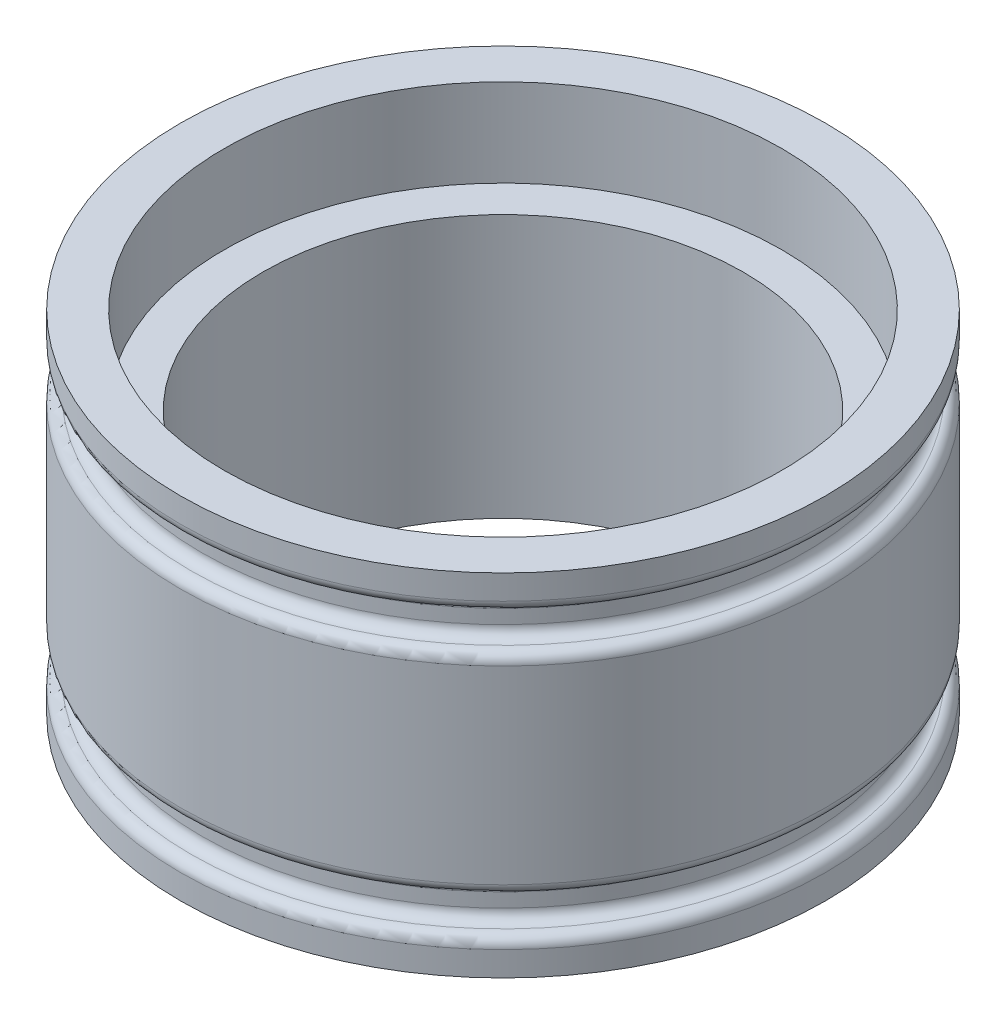
ISO-10303-21;
HEADER;
FILE_DESCRIPTION(('STEP AP214'),'2;1');
FILE_NAME('part.step','',(''),(''),'','','');
FILE_SCHEMA(('AUTOMOTIVE_DESIGN { 1 0 10303 214 1 1 1 1 }'));
ENDSEC;
DATA;
#1=APPLICATION_CONTEXT('core data for automotive mechanical design processes');
#2=APPLICATION_PROTOCOL_DEFINITION('international standard','automotive_design',2000,#1);
#3=PRODUCT_CONTEXT('',#1,'mechanical');
#4=PRODUCT('Part','Part','',(#3));
#5=PRODUCT_RELATED_PRODUCT_CATEGORY('part','',(#4));
#6=PRODUCT_DEFINITION_FORMATION('','',#4);
#7=PRODUCT_DEFINITION_CONTEXT('part definition',#1,'design');
#8=PRODUCT_DEFINITION('design','',#6,#7);
#9=PRODUCT_DEFINITION_SHAPE('','',#8);
#10=(LENGTH_UNIT() NAMED_UNIT(*) SI_UNIT(.MILLI.,.METRE.));
#11=(NAMED_UNIT(*) PLANE_ANGLE_UNIT() SI_UNIT($,.RADIAN.));
#12=(NAMED_UNIT(*) SI_UNIT($,.STERADIAN.) SOLID_ANGLE_UNIT());
#13=UNCERTAINTY_MEASURE_WITH_UNIT(LENGTH_MEASURE(1.E-05),#10,'distance_accuracy_value','');
#14=(GEOMETRIC_REPRESENTATION_CONTEXT(3) GLOBAL_UNCERTAINTY_ASSIGNED_CONTEXT((#13)) GLOBAL_UNIT_ASSIGNED_CONTEXT((#10,
#11,#12)) REPRESENTATION_CONTEXT('',''));
#15=CARTESIAN_POINT('',(0.,0.,0.));
#16=DIRECTION('',(0.,0.,1.));
#17=DIRECTION('',(1.,0.,0.));
#18=AXIS2_PLACEMENT_3D('',#15,#16,#17);
#19=CARTESIAN_POINT('',(0.,25.4,0.));
#20=DIRECTION('',(0.,-1.,0.));
#21=DIRECTION('',(0.,0.,-1.));
#22=AXIS2_PLACEMENT_3D('',#19,#20,#21);
#23=CYLINDRICAL_SURFACE('',#22,23.368);
#24=CARTESIAN_POINT('',(0.,1.778,0.));
#25=DIRECTION('',(0.,-1.,0.));
#26=DIRECTION('',(0.,0.,-1.));
#27=AXIS2_PLACEMENT_3D('',#24,#25,#26);
#28=CIRCLE('',#27,23.368);
#29=CARTESIAN_POINT('',(0.,1.778,-23.368));
#30=VERTEX_POINT('',#29);
#31=EDGE_CURVE('E134',#30,#30,#28,.T.);
#32=ORIENTED_EDGE('',*,*,#31,.T.);
#33=EDGE_LOOP('',(#32));
#34=FACE_BOUND('',#33,.T.);
#35=CARTESIAN_POINT('',(0.,0.,0.));
#36=DIRECTION('',(0.,1.,0.));
#37=DIRECTION('',(0.,0.,1.));
#38=AXIS2_PLACEMENT_3D('',#35,#36,#37);
#39=CIRCLE('',#38,23.368);
#40=CARTESIAN_POINT('',(0.,0.,23.368));
#41=VERTEX_POINT('',#40);
#42=EDGE_CURVE('E169',#41,#41,#39,.T.);
#43=ORIENTED_EDGE('',*,*,#42,.T.);
#44=EDGE_LOOP('',(#43));
#45=FACE_BOUND('',#44,.T.);
#46=ADVANCED_FACE('F41',(#34,#45),#23,.T.);
#47=CARTESIAN_POINT('',(0.,25.4,0.));
#48=DIRECTION('',(0.,1.,0.));
#49=DIRECTION('',(0.,0.,1.));
#50=AXIS2_PLACEMENT_3D('',#47,#48,#49);
#51=PLANE('',#50);
#52=CARTESIAN_POINT('',(0.,25.4,0.));
#53=DIRECTION('',(0.,1.,0.));
#54=DIRECTION('',(0.,0.,1.));
#55=AXIS2_PLACEMENT_3D('',#52,#53,#54);
#56=CIRCLE('',#55,23.368);
#57=CARTESIAN_POINT('',(0.,25.4,23.368));
#58=VERTEX_POINT('',#57);
#59=EDGE_CURVE('E166',#58,#58,#56,.T.);
#60=ORIENTED_EDGE('',*,*,#59,.T.);
#61=EDGE_LOOP('',(#60));
#62=FACE_BOUND('',#61,.T.);
#63=CARTESIAN_POINT('',(0.,25.4,0.));
#64=DIRECTION('',(0.,1.,0.));
#65=DIRECTION('',(0.,0.,1.));
#66=AXIS2_PLACEMENT_3D('',#63,#64,#65);
#67=CIRCLE('',#66,20.193);
#68=CARTESIAN_POINT('',(0.,25.4,20.193));
#69=VERTEX_POINT('',#68);
#70=EDGE_CURVE('E173',#69,#69,#67,.T.);
#71=ORIENTED_EDGE('',*,*,#70,.F.);
#72=EDGE_LOOP('',(#71));
#73=FACE_BOUND('',#72,.T.);
#74=ADVANCED_FACE('F91',(#62,#73),#51,.T.);
#75=CARTESIAN_POINT('',(0.,0.,0.));
#76=DIRECTION('',(0.,1.,0.));
#77=DIRECTION('',(0.,0.,1.));
#78=AXIS2_PLACEMENT_3D('',#75,#76,#77);
#79=PLANE('',#78);
#80=ORIENTED_EDGE('',*,*,#42,.F.);
#81=EDGE_LOOP('',(#80));
#82=FACE_BOUND('',#81,.T.);
#83=CARTESIAN_POINT('',(0.,0.,0.));
#84=DIRECTION('',(0.,-1.,0.));
#85=DIRECTION('',(0.,0.,-1.));
#86=AXIS2_PLACEMENT_3D('',#83,#84,#85);
#87=CIRCLE('',#86,17.399);
#88=CARTESIAN_POINT('',(0.,0.,-17.399));
#89=VERTEX_POINT('',#88);
#90=EDGE_CURVE('E64',#89,#89,#87,.T.);
#91=ORIENTED_EDGE('',*,*,#90,.F.);
#92=EDGE_LOOP('',(#91));
#93=FACE_BOUND('',#92,.T.);
#94=ADVANCED_FACE('F99',(#82,#93),#79,.F.);
#95=CARTESIAN_POINT('',(0.,23.622,0.));
#96=DIRECTION('',(0.,1.,0.));
#97=DIRECTION('',(0.,0.,1.));
#98=AXIS2_PLACEMENT_3D('',#95,#96,#97);
#99=CIRCLE('',#98,23.368);
#100=CARTESIAN_POINT('',(0.,23.622,23.368));
#101=VERTEX_POINT('',#100);
#102=EDGE_CURVE('E11',#101,#101,#99,.T.);
#103=ORIENTED_EDGE('',*,*,#102,.T.);
#104=EDGE_LOOP('',(#103));
#105=FACE_BOUND('',#104,.T.);
#106=ORIENTED_EDGE('',*,*,#59,.F.);
#107=EDGE_LOOP('',(#106));
#108=FACE_BOUND('',#107,.T.);
#109=ADVANCED_FACE('F94',(#105,#108),#23,.T.);
#110=CARTESIAN_POINT('',(0.,25.4,0.));
#111=DIRECTION('',(0.,-1.,0.));
#112=DIRECTION('',(0.,0.,-1.));
#113=AXIS2_PLACEMENT_3D('',#110,#111,#112);
#114=CYLINDRICAL_SURFACE('',#113,20.193);
#115=CARTESIAN_POINT('',(0.,19.05,0.));
#116=DIRECTION('',(0.,1.,0.));
#117=DIRECTION('',(0.,0.,1.));
#118=AXIS2_PLACEMENT_3D('',#115,#116,#117);
#119=CIRCLE('',#118,20.193);
#120=CARTESIAN_POINT('',(0.,19.05,20.193));
#121=VERTEX_POINT('',#120);
#122=EDGE_CURVE('E163',#121,#121,#119,.T.);
#123=ORIENTED_EDGE('',*,*,#122,.F.);
#124=EDGE_LOOP('',(#123));
#125=FACE_BOUND('',#124,.T.);
#126=ORIENTED_EDGE('',*,*,#70,.T.);
#127=EDGE_LOOP('',(#126));
#128=FACE_BOUND('',#127,.T.);
#129=ADVANCED_FACE('F107',(#125,#128),#114,.F.);
#130=CARTESIAN_POINT('',(0.,82.5144289299998,0.));
#131=DIRECTION('',(0.,-1.,0.));
#132=DIRECTION('',(0.,0.,-1.));
#133=AXIS2_PLACEMENT_3D('',#130,#131,#132);
#134=CYLINDRICAL_SURFACE('',#133,17.399);
#135=ORIENTED_EDGE('',*,*,#90,.T.);
#136=EDGE_LOOP('',(#135));
#137=FACE_BOUND('',#136,.T.);
#138=CARTESIAN_POINT('',(0.,19.05,0.));
#139=DIRECTION('',(0.,1.,0.));
#140=DIRECTION('',(0.,0.,1.));
#141=AXIS2_PLACEMENT_3D('',#138,#139,#140);
#142=CIRCLE('',#141,17.399);
#143=CARTESIAN_POINT('',(0.,19.05,17.399));
#144=VERTEX_POINT('',#143);
#145=EDGE_CURVE('E180',#144,#144,#142,.F.);
#146=ORIENTED_EDGE('',*,*,#145,.F.);
#147=EDGE_LOOP('',(#146));
#148=FACE_BOUND('',#147,.T.);
#149=ADVANCED_FACE('F188',(#137,#148),#134,.F.);
#150=CARTESIAN_POINT('',(0.,19.05,0.));
#151=DIRECTION('',(0.,1.,0.));
#152=DIRECTION('',(0.,0.,1.));
#153=AXIS2_PLACEMENT_3D('',#150,#151,#152);
#154=PLANE('',#153);
#155=ORIENTED_EDGE('',*,*,#122,.T.);
#156=EDGE_LOOP('',(#155));
#157=FACE_BOUND('',#156,.T.);
#158=ORIENTED_EDGE('',*,*,#145,.T.);
#159=EDGE_LOOP('',(#158));
#160=FACE_BOUND('',#159,.T.);
#161=ADVANCED_FACE('F157',(#157,#160),#154,.T.);
#162=CARTESIAN_POINT('',(0.,0.,0.));
#163=DIRECTION('',(0.,1.,0.));
#164=DIRECTION('',(0.,0.,1.));
#165=AXIS2_PLACEMENT_3D('',#162,#163,#164);
#166=CYLINDRICAL_SURFACE('',#165,21.844);
#167=CARTESIAN_POINT('',(0.,3.302,0.));
#168=DIRECTION('',(0.,-1.,0.));
#169=DIRECTION('',(0.,0.,-1.));
#170=AXIS2_PLACEMENT_3D('',#167,#168,#169);
#171=CIRCLE('',#170,21.844);
#172=CARTESIAN_POINT('',(0.,3.302,-21.844));
#173=VERTEX_POINT('',#172);
#174=EDGE_CURVE('E130',#173,#173,#171,.F.);
#175=ORIENTED_EDGE('',*,*,#174,.T.);
#176=EDGE_LOOP('',(#175));
#177=FACE_BOUND('',#176,.T.);
#178=CARTESIAN_POINT('',(0.,4.318,0.));
#179=DIRECTION('',(0.,1.,0.));
#180=DIRECTION('',(0.,0.,1.));
#181=AXIS2_PLACEMENT_3D('',#178,#179,#180);
#182=CIRCLE('',#181,21.844);
#183=CARTESIAN_POINT('',(0.,4.318,21.844));
#184=VERTEX_POINT('',#183);
#185=EDGE_CURVE('E137',#184,#184,#182,.F.);
#186=ORIENTED_EDGE('',*,*,#185,.T.);
#187=EDGE_LOOP('',(#186));
#188=FACE_BOUND('',#187,.T.);
#189=ADVANCED_FACE('F119',(#177,#188),#166,.T.);
#190=CARTESIAN_POINT('',(0.,0.,0.));
#191=DIRECTION('',(0.,1.,0.));
#192=DIRECTION('',(0.,0.,1.));
#193=AXIS2_PLACEMENT_3D('',#190,#191,#192);
#194=CYLINDRICAL_SURFACE('',#193,21.844);
#195=CARTESIAN_POINT('',(0.,21.082,0.));
#196=DIRECTION('',(0.,-1.,0.));
#197=DIRECTION('',(0.,0.,-1.));
#198=AXIS2_PLACEMENT_3D('',#195,#196,#197);
#199=CIRCLE('',#198,21.844);
#200=CARTESIAN_POINT('',(0.,21.082,-21.844));
#201=VERTEX_POINT('',#200);
#202=EDGE_CURVE('E50',#201,#201,#199,.F.);
#203=ORIENTED_EDGE('',*,*,#202,.T.);
#204=EDGE_LOOP('',(#203));
#205=FACE_BOUND('',#204,.T.);
#206=CARTESIAN_POINT('',(0.,22.098,0.));
#207=DIRECTION('',(0.,1.,0.));
#208=DIRECTION('',(0.,0.,1.));
#209=AXIS2_PLACEMENT_3D('',#206,#207,#208);
#210=CIRCLE('',#209,21.844);
#211=CARTESIAN_POINT('',(0.,22.098,21.844));
#212=VERTEX_POINT('',#211);
#213=EDGE_CURVE('E56',#212,#212,#210,.F.);
#214=ORIENTED_EDGE('',*,*,#213,.T.);
#215=EDGE_LOOP('',(#214));
#216=FACE_BOUND('',#215,.T.);
#217=ADVANCED_FACE('F110',(#205,#216),#194,.T.);
#218=CARTESIAN_POINT('',(0.,5.842,0.));
#219=DIRECTION('',(0.,1.,0.));
#220=DIRECTION('',(0.,0.,1.));
#221=AXIS2_PLACEMENT_3D('',#218,#219,#220);
#222=CIRCLE('',#221,23.368);
#223=CARTESIAN_POINT('',(0.,5.842,23.368));
#224=VERTEX_POINT('',#223);
#225=EDGE_CURVE('E125',#224,#224,#222,.T.);
#226=ORIENTED_EDGE('',*,*,#225,.T.);
#227=EDGE_LOOP('',(#226));
#228=FACE_BOUND('',#227,.T.);
#229=CARTESIAN_POINT('',(0.,19.558,0.));
#230=DIRECTION('',(0.,-1.,0.));
#231=DIRECTION('',(0.,0.,-1.));
#232=AXIS2_PLACEMENT_3D('',#229,#230,#231);
#233=CIRCLE('',#232,23.368);
#234=CARTESIAN_POINT('',(0.,19.558,-23.368));
#235=VERTEX_POINT('',#234);
#236=EDGE_CURVE('E128',#235,#235,#233,.T.);
#237=ORIENTED_EDGE('',*,*,#236,.T.);
#238=EDGE_LOOP('',(#237));
#239=FACE_BOUND('',#238,.T.);
#240=ADVANCED_FACE('F95',(#228,#239),#23,.T.);
#241=CARTESIAN_POINT('',(0.,1.778,0.));
#242=DIRECTION('',(0.,-1.,0.));
#243=DIRECTION('',(0.,0.,-1.));
#244=AXIS2_PLACEMENT_3D('',#241,#242,#243);
#245=TOROIDAL_SURFACE('',#244,22.606,0.762);
#246=ORIENTED_EDGE('',*,*,#31,.F.);
#247=EDGE_LOOP('',(#246));
#248=FACE_BOUND('',#247,.T.);
#249=CARTESIAN_POINT('',(0.,2.54,0.));
#250=DIRECTION('',(0.,-1.,0.));
#251=DIRECTION('',(0.,0.,-1.));
#252=AXIS2_PLACEMENT_3D('',#249,#250,#251);
#253=CIRCLE('',#252,22.606);
#254=CARTESIAN_POINT('',(0.,2.54,-22.606));
#255=VERTEX_POINT('',#254);
#256=EDGE_CURVE('E60',#255,#255,#253,.F.);
#257=ORIENTED_EDGE('',*,*,#256,.F.);
#258=EDGE_LOOP('',(#257));
#259=FACE_BOUND('',#258,.T.);
#260=ADVANCED_FACE('F109',(#248,#259),#245,.T.);
#261=CARTESIAN_POINT('',(0.,3.302,0.));
#262=DIRECTION('',(0.,-1.,0.));
#263=DIRECTION('',(0.,0.,-1.));
#264=AXIS2_PLACEMENT_3D('',#261,#262,#263);
#265=TOROIDAL_SURFACE('',#264,22.606,0.762);
#266=ORIENTED_EDGE('',*,*,#256,.T.);
#267=EDGE_LOOP('',(#266));
#268=FACE_BOUND('',#267,.T.);
#269=ORIENTED_EDGE('',*,*,#174,.F.);
#270=EDGE_LOOP('',(#269));
#271=FACE_BOUND('',#270,.T.);
#272=ADVANCED_FACE('F116',(#268,#271),#265,.F.);
#273=CARTESIAN_POINT('',(0.,5.842,0.));
#274=DIRECTION('',(0.,1.,0.));
#275=DIRECTION('',(0.,0.,1.));
#276=AXIS2_PLACEMENT_3D('',#273,#274,#275);
#277=TOROIDAL_SURFACE('',#276,22.606,0.762);
#278=ORIENTED_EDGE('',*,*,#225,.F.);
#279=EDGE_LOOP('',(#278));
#280=FACE_BOUND('',#279,.T.);
#281=CARTESIAN_POINT('',(0.,5.08,0.));
#282=DIRECTION('',(0.,1.,0.));
#283=DIRECTION('',(0.,0.,1.));
#284=AXIS2_PLACEMENT_3D('',#281,#282,#283);
#285=CIRCLE('',#284,22.606);
#286=CARTESIAN_POINT('',(0.,5.08,22.606));
#287=VERTEX_POINT('',#286);
#288=EDGE_CURVE('E65',#287,#287,#285,.F.);
#289=ORIENTED_EDGE('',*,*,#288,.F.);
#290=EDGE_LOOP('',(#289));
#291=FACE_BOUND('',#290,.T.);
#292=ADVANCED_FACE('F152',(#280,#291),#277,.T.);
#293=CARTESIAN_POINT('',(0.,4.318,0.));
#294=DIRECTION('',(0.,1.,0.));
#295=DIRECTION('',(0.,0.,1.));
#296=AXIS2_PLACEMENT_3D('',#293,#294,#295);
#297=TOROIDAL_SURFACE('',#296,22.606,0.762);
#298=ORIENTED_EDGE('',*,*,#185,.F.);
#299=EDGE_LOOP('',(#298));
#300=FACE_BOUND('',#299,.T.);
#301=ORIENTED_EDGE('',*,*,#288,.T.);
#302=EDGE_LOOP('',(#301));
#303=FACE_BOUND('',#302,.T.);
#304=ADVANCED_FACE('F250',(#300,#303),#297,.F.);
#305=CARTESIAN_POINT('',(0.,21.082,0.));
#306=DIRECTION('',(0.,-1.,0.));
#307=DIRECTION('',(0.,0.,-1.));
#308=AXIS2_PLACEMENT_3D('',#305,#306,#307);
#309=TOROIDAL_SURFACE('',#308,22.606,0.762);
#310=ORIENTED_EDGE('',*,*,#202,.F.);
#311=EDGE_LOOP('',(#310));
#312=FACE_BOUND('',#311,.T.);
#313=CARTESIAN_POINT('',(0.,20.32,0.));
#314=DIRECTION('',(0.,-1.,0.));
#315=DIRECTION('',(0.,0.,-1.));
#316=AXIS2_PLACEMENT_3D('',#313,#314,#315);
#317=CIRCLE('',#316,22.606);
#318=CARTESIAN_POINT('',(0.,20.32,-22.606));
#319=VERTEX_POINT('',#318);
#320=EDGE_CURVE('E68',#319,#319,#317,.T.);
#321=ORIENTED_EDGE('',*,*,#320,.F.);
#322=EDGE_LOOP('',(#321));
#323=FACE_BOUND('',#322,.T.);
#324=ADVANCED_FACE('F87',(#312,#323),#309,.F.);
#325=CARTESIAN_POINT('',(0.,19.558,0.));
#326=DIRECTION('',(0.,-1.,0.));
#327=DIRECTION('',(0.,0.,-1.));
#328=AXIS2_PLACEMENT_3D('',#325,#326,#327);
#329=TOROIDAL_SURFACE('',#328,22.606,0.762);
#330=ORIENTED_EDGE('',*,*,#236,.F.);
#331=EDGE_LOOP('',(#330));
#332=FACE_BOUND('',#331,.T.);
#333=ORIENTED_EDGE('',*,*,#320,.T.);
#334=EDGE_LOOP('',(#333));
#335=FACE_BOUND('',#334,.T.);
#336=ADVANCED_FACE('F80',(#332,#335),#329,.T.);
#337=CARTESIAN_POINT('',(0.,23.622,0.));
#338=DIRECTION('',(0.,1.,0.));
#339=DIRECTION('',(0.,0.,1.));
#340=AXIS2_PLACEMENT_3D('',#337,#338,#339);
#341=TOROIDAL_SURFACE('',#340,22.606,0.762);
#342=ORIENTED_EDGE('',*,*,#102,.F.);
#343=EDGE_LOOP('',(#342));
#344=FACE_BOUND('',#343,.T.);
#345=CARTESIAN_POINT('',(0.,22.86,0.));
#346=DIRECTION('',(0.,1.,0.));
#347=DIRECTION('',(0.,0.,1.));
#348=AXIS2_PLACEMENT_3D('',#345,#346,#347);
#349=CIRCLE('',#348,22.606);
#350=CARTESIAN_POINT('',(0.,22.86,22.606));
#351=VERTEX_POINT('',#350);
#352=EDGE_CURVE('E45',#351,#351,#349,.F.);
#353=ORIENTED_EDGE('',*,*,#352,.F.);
#354=EDGE_LOOP('',(#353));
#355=FACE_BOUND('',#354,.T.);
#356=ADVANCED_FACE('F43',(#344,#355),#341,.T.);
#357=CARTESIAN_POINT('',(0.,22.098,0.));
#358=DIRECTION('',(0.,1.,0.));
#359=DIRECTION('',(0.,0.,1.));
#360=AXIS2_PLACEMENT_3D('',#357,#358,#359);
#361=TOROIDAL_SURFACE('',#360,22.606,0.762);
#362=ORIENTED_EDGE('',*,*,#213,.F.);
#363=EDGE_LOOP('',(#362));
#364=FACE_BOUND('',#363,.T.);
#365=ORIENTED_EDGE('',*,*,#352,.T.);
#366=EDGE_LOOP('',(#365));
#367=FACE_BOUND('',#366,.T.);
#368=ADVANCED_FACE('F77',(#364,#367),#361,.F.);
#369=CLOSED_SHELL('',(#46,#74,#94,#109,#129,#149,#161,#189,#217,#240,#260,#272,#292,#304,#324,
#336,#356,#368));
#370=MANIFOLD_SOLID_BREP('B2',#369);
#371=ADVANCED_BREP_SHAPE_REPRESENTATION('',(#18,#370),#14);
#372=SHAPE_DEFINITION_REPRESENTATION(#9,#371);
ENDSEC;
END-ISO-10303-21;
